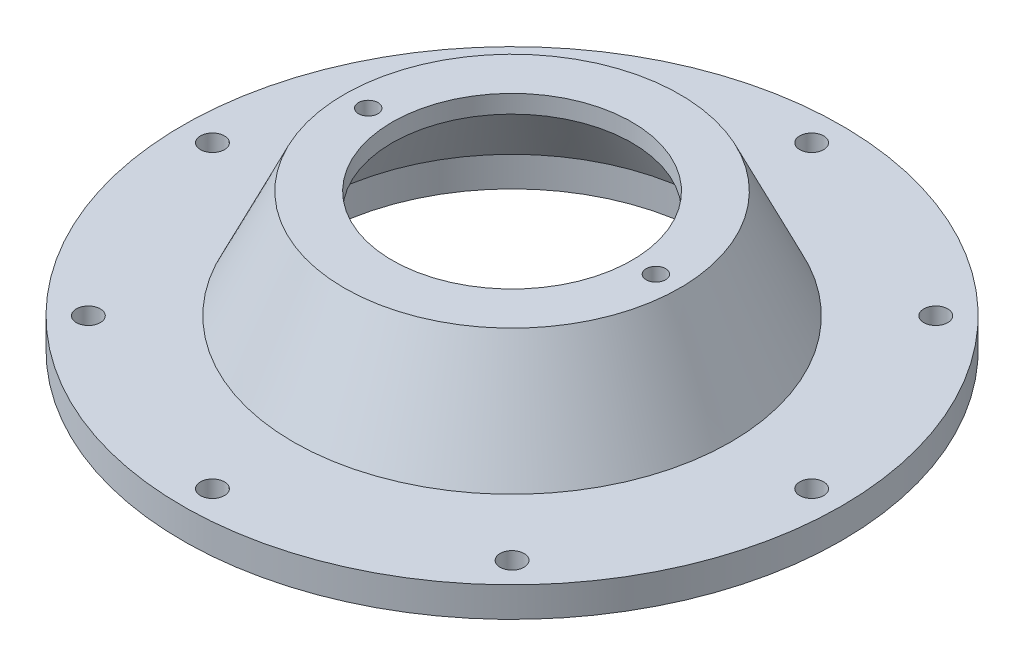
ISO-10303-21;
HEADER;
FILE_DESCRIPTION(('STEP AP214'),'2;1');
FILE_NAME('part.step','',(''),(''),'','','');
FILE_SCHEMA(('AUTOMOTIVE_DESIGN { 1 0 10303 214 1 1 1 1 }'));
ENDSEC;
DATA;
#1=APPLICATION_CONTEXT('core data for automotive mechanical design processes');
#2=APPLICATION_PROTOCOL_DEFINITION('international standard','automotive_design',2000,#1);
#3=PRODUCT_CONTEXT('',#1,'mechanical');
#4=PRODUCT('Part','Part','',(#3));
#5=PRODUCT_RELATED_PRODUCT_CATEGORY('part','',(#4));
#6=PRODUCT_DEFINITION_FORMATION('','',#4);
#7=PRODUCT_DEFINITION_CONTEXT('part definition',#1,'design');
#8=PRODUCT_DEFINITION('design','',#6,#7);
#9=PRODUCT_DEFINITION_SHAPE('','',#8);
#10=(LENGTH_UNIT() NAMED_UNIT(*) SI_UNIT(.MILLI.,.METRE.));
#11=(NAMED_UNIT(*) PLANE_ANGLE_UNIT() SI_UNIT($,.RADIAN.));
#12=(NAMED_UNIT(*) SI_UNIT($,.STERADIAN.) SOLID_ANGLE_UNIT());
#13=UNCERTAINTY_MEASURE_WITH_UNIT(LENGTH_MEASURE(1.E-05),#10,'distance_accuracy_value','');
#14=(GEOMETRIC_REPRESENTATION_CONTEXT(3) GLOBAL_UNCERTAINTY_ASSIGNED_CONTEXT((#13)) GLOBAL_UNIT_ASSIGNED_CONTEXT((#10,
#11,#12)) REPRESENTATION_CONTEXT('',''));
#15=CARTESIAN_POINT('',(0.,0.,0.));
#16=DIRECTION('',(0.,0.,1.));
#17=DIRECTION('',(1.,0.,0.));
#18=AXIS2_PLACEMENT_3D('',#15,#16,#17);
#19=CARTESIAN_POINT('',(0.,0.,0.));
#20=DIRECTION('',(0.,1.,0.));
#21=DIRECTION('',(1.,0.,0.));
#22=AXIS2_PLACEMENT_3D('',#19,#20,#21);
#23=PLANE('',#22);
#24=CARTESIAN_POINT('',(0.,0.,0.));
#25=DIRECTION('',(0.,-1.,0.));
#26=DIRECTION('',(1.,0.,0.));
#27=AXIS2_PLACEMENT_3D('',#24,#25,#26);
#28=CIRCLE('',#27,33.);
#29=CARTESIAN_POINT('',(-33.,0.,0.));
#30=VERTEX_POINT('',#29);
#31=EDGE_CURVE('E280',#30,#30,#28,.T.);
#32=ORIENTED_EDGE('',*,*,#31,.F.);
#33=EDGE_LOOP('',(#32));
#34=FACE_BOUND('',#33,.T.);
#35=CARTESIAN_POINT('',(-35.3553390593274,0.,-35.3553390593274));
#36=DIRECTION('',(0.,1.,0.));
#37=DIRECTION('',(1.,0.,0.));
#38=AXIS2_PLACEMENT_3D('',#35,#36,#37);
#39=CIRCLE('',#38,2.);
#40=CARTESIAN_POINT('',(-37.3553390593274,0.,-35.3553390593274));
#41=VERTEX_POINT('',#40);
#42=EDGE_CURVE('E281',#41,#41,#39,.T.);
#43=ORIENTED_EDGE('',*,*,#42,.T.);
#44=EDGE_LOOP('',(#43));
#45=FACE_BOUND('',#44,.T.);
#46=CARTESIAN_POINT('',(35.3553390593274,0.,-35.3553390593274));
#47=DIRECTION('',(0.,1.,0.));
#48=DIRECTION('',(1.,0.,0.));
#49=AXIS2_PLACEMENT_3D('',#46,#47,#48);
#50=CIRCLE('',#49,2.);
#51=CARTESIAN_POINT('',(33.3553390593274,0.,-35.3553390593274));
#52=VERTEX_POINT('',#51);
#53=EDGE_CURVE('E181',#52,#52,#50,.T.);
#54=ORIENTED_EDGE('',*,*,#53,.T.);
#55=EDGE_LOOP('',(#54));
#56=FACE_BOUND('',#55,.T.);
#57=CARTESIAN_POINT('',(35.3553390593274,0.,35.3553390593274));
#58=DIRECTION('',(0.,1.,0.));
#59=DIRECTION('',(1.,0.,0.));
#60=AXIS2_PLACEMENT_3D('',#57,#58,#59);
#61=CIRCLE('',#60,2.);
#62=CARTESIAN_POINT('',(33.3553390593274,0.,35.3553390593274));
#63=VERTEX_POINT('',#62);
#64=EDGE_CURVE('E244',#63,#63,#61,.T.);
#65=ORIENTED_EDGE('',*,*,#64,.T.);
#66=EDGE_LOOP('',(#65));
#67=FACE_BOUND('',#66,.T.);
#68=CARTESIAN_POINT('',(-35.3553390593274,0.,35.3553390593274));
#69=DIRECTION('',(0.,1.,0.));
#70=DIRECTION('',(1.,0.,0.));
#71=AXIS2_PLACEMENT_3D('',#68,#69,#70);
#72=CIRCLE('',#71,2.);
#73=CARTESIAN_POINT('',(-37.3553390593274,0.,35.3553390593274));
#74=VERTEX_POINT('',#73);
#75=EDGE_CURVE('E231',#74,#74,#72,.T.);
#76=ORIENTED_EDGE('',*,*,#75,.T.);
#77=EDGE_LOOP('',(#76));
#78=FACE_BOUND('',#77,.T.);
#79=CARTESIAN_POINT('',(-50.,0.,0.));
#80=DIRECTION('',(0.,1.,0.));
#81=DIRECTION('',(1.,0.,0.));
#82=AXIS2_PLACEMENT_3D('',#79,#80,#81);
#83=CIRCLE('',#82,2.);
#84=CARTESIAN_POINT('',(-52.,0.,0.));
#85=VERTEX_POINT('',#84);
#86=EDGE_CURVE('E222',#85,#85,#83,.T.);
#87=ORIENTED_EDGE('',*,*,#86,.T.);
#88=EDGE_LOOP('',(#87));
#89=FACE_BOUND('',#88,.T.);
#90=CARTESIAN_POINT('',(0.,0.,50.));
#91=DIRECTION('',(0.,1.,0.));
#92=DIRECTION('',(1.,0.,0.));
#93=AXIS2_PLACEMENT_3D('',#90,#91,#92);
#94=CIRCLE('',#93,2.);
#95=CARTESIAN_POINT('',(-2.,0.,50.));
#96=VERTEX_POINT('',#95);
#97=EDGE_CURVE('E185',#96,#96,#94,.T.);
#98=ORIENTED_EDGE('',*,*,#97,.T.);
#99=EDGE_LOOP('',(#98));
#100=FACE_BOUND('',#99,.T.);
#101=CARTESIAN_POINT('',(50.,0.,0.));
#102=DIRECTION('',(0.,1.,0.));
#103=DIRECTION('',(1.,0.,0.));
#104=AXIS2_PLACEMENT_3D('',#101,#102,#103);
#105=CIRCLE('',#104,2.);
#106=CARTESIAN_POINT('',(48.,0.,0.));
#107=VERTEX_POINT('',#106);
#108=EDGE_CURVE('E199',#107,#107,#105,.T.);
#109=ORIENTED_EDGE('',*,*,#108,.T.);
#110=EDGE_LOOP('',(#109));
#111=FACE_BOUND('',#110,.T.);
#112=CARTESIAN_POINT('',(0.,0.,-50.));
#113=DIRECTION('',(0.,1.,0.));
#114=DIRECTION('',(1.,0.,0.));
#115=AXIS2_PLACEMENT_3D('',#112,#113,#114);
#116=CIRCLE('',#115,2.);
#117=CARTESIAN_POINT('',(-2.,0.,-50.));
#118=VERTEX_POINT('',#117);
#119=EDGE_CURVE('E210',#118,#118,#116,.T.);
#120=ORIENTED_EDGE('',*,*,#119,.T.);
#121=EDGE_LOOP('',(#120));
#122=FACE_BOUND('',#121,.T.);
#123=CARTESIAN_POINT('',(0.,0.,0.));
#124=DIRECTION('',(0.,1.,0.));
#125=DIRECTION('',(-1.,0.,0.));
#126=AXIS2_PLACEMENT_3D('',#123,#124,#125);
#127=CIRCLE('',#126,55.);
#128=CARTESIAN_POINT('',(55.,0.,0.));
#129=VERTEX_POINT('',#128);
#130=EDGE_CURVE('E10',#129,#129,#127,.T.);
#131=ORIENTED_EDGE('',*,*,#130,.F.);
#132=EDGE_LOOP('',(#131));
#133=FACE_BOUND('',#132,.T.);
#134=ADVANCED_FACE('F16',(#34,#45,#56,#67,#78,#89,#100,#111,#122,#133),#23,.F.);
#135=CARTESIAN_POINT('',(0.,5.,0.));
#136=DIRECTION('',(0.,1.,0.));
#137=DIRECTION('',(1.,0.,0.));
#138=AXIS2_PLACEMENT_3D('',#135,#136,#137);
#139=PLANE('',#138);
#140=CARTESIAN_POINT('',(0.,5.,0.));
#141=DIRECTION('',(0.,-1.,0.));
#142=DIRECTION('',(0.,0.,-1.));
#143=AXIS2_PLACEMENT_3D('',#140,#141,#142);
#144=CIRCLE('',#143,36.5);
#145=CARTESIAN_POINT('',(0.,5.,36.5));
#146=VERTEX_POINT('',#145);
#147=EDGE_CURVE('E272',#146,#146,#144,.T.);
#148=ORIENTED_EDGE('',*,*,#147,.T.);
#149=EDGE_LOOP('',(#148));
#150=FACE_BOUND('',#149,.T.);
#151=CARTESIAN_POINT('',(-35.3553390593274,5.,-35.3553390593274));
#152=DIRECTION('',(0.,-1.,0.));
#153=DIRECTION('',(1.,0.,0.));
#154=AXIS2_PLACEMENT_3D('',#151,#152,#153);
#155=CIRCLE('',#154,2.);
#156=CARTESIAN_POINT('',(-37.3553390593274,5.,-35.3553390593274));
#157=VERTEX_POINT('',#156);
#158=EDGE_CURVE('E183',#157,#157,#155,.T.);
#159=ORIENTED_EDGE('',*,*,#158,.T.);
#160=EDGE_LOOP('',(#159));
#161=FACE_BOUND('',#160,.T.);
#162=CARTESIAN_POINT('',(35.3553390593274,5.,-35.3553390593274));
#163=DIRECTION('',(0.,-1.,0.));
#164=DIRECTION('',(1.,0.,0.));
#165=AXIS2_PLACEMENT_3D('',#162,#163,#164);
#166=CIRCLE('',#165,2.);
#167=CARTESIAN_POINT('',(33.3553390593274,5.,-35.3553390593274));
#168=VERTEX_POINT('',#167);
#169=EDGE_CURVE('E204',#168,#168,#166,.T.);
#170=ORIENTED_EDGE('',*,*,#169,.T.);
#171=EDGE_LOOP('',(#170));
#172=FACE_BOUND('',#171,.T.);
#173=CARTESIAN_POINT('',(35.3553390593274,5.,35.3553390593274));
#174=DIRECTION('',(0.,-1.,0.));
#175=DIRECTION('',(1.,0.,0.));
#176=AXIS2_PLACEMENT_3D('',#173,#174,#175);
#177=CIRCLE('',#176,2.);
#178=CARTESIAN_POINT('',(33.3553390593274,5.,35.3553390593274));
#179=VERTEX_POINT('',#178);
#180=EDGE_CURVE('E226',#179,#179,#177,.T.);
#181=ORIENTED_EDGE('',*,*,#180,.T.);
#182=EDGE_LOOP('',(#181));
#183=FACE_BOUND('',#182,.T.);
#184=CARTESIAN_POINT('',(-35.3553390593274,5.,35.3553390593274));
#185=DIRECTION('',(0.,-1.,0.));
#186=DIRECTION('',(1.,0.,0.));
#187=AXIS2_PLACEMENT_3D('',#184,#185,#186);
#188=CIRCLE('',#187,2.);
#189=CARTESIAN_POINT('',(-37.3553390593274,5.,35.3553390593274));
#190=VERTEX_POINT('',#189);
#191=EDGE_CURVE('E218',#190,#190,#188,.T.);
#192=ORIENTED_EDGE('',*,*,#191,.T.);
#193=EDGE_LOOP('',(#192));
#194=FACE_BOUND('',#193,.T.);
#195=CARTESIAN_POINT('',(-50.,5.,0.));
#196=DIRECTION('',(0.,-1.,0.));
#197=DIRECTION('',(1.,0.,0.));
#198=AXIS2_PLACEMENT_3D('',#195,#196,#197);
#199=CIRCLE('',#198,2.);
#200=CARTESIAN_POINT('',(-52.,5.,0.));
#201=VERTEX_POINT('',#200);
#202=EDGE_CURVE('E189',#201,#201,#199,.T.);
#203=ORIENTED_EDGE('',*,*,#202,.T.);
#204=EDGE_LOOP('',(#203));
#205=FACE_BOUND('',#204,.T.);
#206=CARTESIAN_POINT('',(0.,5.,50.));
#207=DIRECTION('',(0.,-1.,0.));
#208=DIRECTION('',(1.,0.,0.));
#209=AXIS2_PLACEMENT_3D('',#206,#207,#208);
#210=CIRCLE('',#209,2.);
#211=CARTESIAN_POINT('',(-2.,5.,50.));
#212=VERTEX_POINT('',#211);
#213=EDGE_CURVE('E251',#212,#212,#210,.T.);
#214=ORIENTED_EDGE('',*,*,#213,.T.);
#215=EDGE_LOOP('',(#214));
#216=FACE_BOUND('',#215,.T.);
#217=CARTESIAN_POINT('',(50.,5.,0.));
#218=DIRECTION('',(0.,-1.,0.));
#219=DIRECTION('',(1.,0.,0.));
#220=AXIS2_PLACEMENT_3D('',#217,#218,#219);
#221=CIRCLE('',#220,2.);
#222=CARTESIAN_POINT('',(48.,5.,0.));
#223=VERTEX_POINT('',#222);
#224=EDGE_CURVE('E200',#223,#223,#221,.T.);
#225=ORIENTED_EDGE('',*,*,#224,.T.);
#226=EDGE_LOOP('',(#225));
#227=FACE_BOUND('',#226,.T.);
#228=CARTESIAN_POINT('',(0.,5.,-50.));
#229=DIRECTION('',(0.,-1.,0.));
#230=DIRECTION('',(1.,0.,0.));
#231=AXIS2_PLACEMENT_3D('',#228,#229,#230);
#232=CIRCLE('',#231,2.);
#233=CARTESIAN_POINT('',(-2.,5.,-50.));
#234=VERTEX_POINT('',#233);
#235=EDGE_CURVE('E193',#234,#234,#232,.T.);
#236=ORIENTED_EDGE('',*,*,#235,.T.);
#237=EDGE_LOOP('',(#236));
#238=FACE_BOUND('',#237,.T.);
#239=CARTESIAN_POINT('',(0.,5.,0.));
#240=DIRECTION('',(0.,1.,0.));
#241=DIRECTION('',(-1.,0.,0.));
#242=AXIS2_PLACEMENT_3D('',#239,#240,#241);
#243=CIRCLE('',#242,55.);
#244=CARTESIAN_POINT('',(55.,5.,0.));
#245=VERTEX_POINT('',#244);
#246=EDGE_CURVE('E238',#245,#245,#243,.T.);
#247=ORIENTED_EDGE('',*,*,#246,.T.);
#248=EDGE_LOOP('',(#247));
#249=FACE_BOUND('',#248,.T.);
#250=ADVANCED_FACE('F291',(#150,#161,#172,#183,#194,#205,#216,#227,#238,#249),#139,.T.);
#251=CARTESIAN_POINT('',(0.,0.,0.));
#252=DIRECTION('',(0.,1.,0.));
#253=DIRECTION('',(-1.,0.,0.));
#254=AXIS2_PLACEMENT_3D('',#251,#252,#253);
#255=CYLINDRICAL_SURFACE('',#254,55.);
#256=ORIENTED_EDGE('',*,*,#246,.F.);
#257=DIRECTION('',(0.,-1.,0.));
#258=VECTOR('',#257,1.);
#259=CARTESIAN_POINT('',(55.,0.,0.));
#260=LINE('',#259,#258);
#261=EDGE_CURVE('E27',#245,#129,#260,.T.);
#262=ORIENTED_EDGE('',*,*,#261,.T.);
#263=ORIENTED_EDGE('',*,*,#130,.T.);
#264=ORIENTED_EDGE('',*,*,#261,.F.);
#265=EDGE_LOOP('',(#256,#262,#263,#264));
#266=FACE_BOUND('',#265,.T.);
#267=ADVANCED_FACE('F294',(#266),#255,.T.);
#268=CARTESIAN_POINT('',(0.,0.,0.));
#269=DIRECTION('',(0.,1.,0.));
#270=DIRECTION('',(1.,0.,0.));
#271=AXIS2_PLACEMENT_3D('',#268,#269,#270);
#272=CYLINDRICAL_SURFACE('',#271,33.);
#273=CARTESIAN_POINT('',(0.,5.,0.));
#274=DIRECTION('',(0.,-1.,0.));
#275=DIRECTION('',(1.,0.,0.));
#276=AXIS2_PLACEMENT_3D('',#273,#274,#275);
#277=CIRCLE('',#276,33.);
#278=CARTESIAN_POINT('',(-33.,5.,0.));
#279=VERTEX_POINT('',#278);
#280=CARTESIAN_POINT('',(0.,5.,33.));
#281=VERTEX_POINT('',#280);
#282=EDGE_CURVE('E205',#279,#281,#277,.T.);
#283=ORIENTED_EDGE('',*,*,#282,.F.);
#284=DIRECTION('',(0.,-1.,0.));
#285=VECTOR('',#284,1.);
#286=CARTESIAN_POINT('',(-33.,0.,0.));
#287=LINE('',#286,#285);
#288=EDGE_CURVE('E359',#279,#30,#287,.T.);
#289=ORIENTED_EDGE('',*,*,#288,.T.);
#290=ORIENTED_EDGE('',*,*,#31,.T.);
#291=ORIENTED_EDGE('',*,*,#288,.F.);
#292=CARTESIAN_POINT('',(0.,5.,0.));
#293=DIRECTION('',(0.,-1.,0.));
#294=DIRECTION('',(1.,0.,0.));
#295=AXIS2_PLACEMENT_3D('',#292,#293,#294);
#296=CIRCLE('',#295,33.);
#297=EDGE_CURVE('E343',#281,#279,#296,.T.);
#298=ORIENTED_EDGE('',*,*,#297,.F.);
#299=EDGE_LOOP('',(#283,#289,#290,#291,#298));
#300=FACE_BOUND('',#299,.T.);
#301=ADVANCED_FACE('F299',(#300),#272,.F.);
#302=CARTESIAN_POINT('',(0.,23.,-28.));
#303=DIRECTION('',(0.,1.,0.));
#304=DIRECTION('',(1.,0.,0.));
#305=AXIS2_PLACEMENT_3D('',#302,#303,#304);
#306=PLANE('',#305);
#307=CARTESIAN_POINT('',(-24.,23.,0.));
#308=DIRECTION('',(0.,-1.,0.));
#309=DIRECTION('',(1.,0.,0.));
#310=AXIS2_PLACEMENT_3D('',#307,#308,#309);
#311=CIRCLE('',#310,1.621);
#312=CARTESIAN_POINT('',(-25.621,23.,0.));
#313=VERTEX_POINT('',#312);
#314=EDGE_CURVE('E239',#313,#313,#311,.T.);
#315=ORIENTED_EDGE('',*,*,#314,.T.);
#316=EDGE_LOOP('',(#315));
#317=FACE_BOUND('',#316,.T.);
#318=CARTESIAN_POINT('',(24.,23.,0.));
#319=DIRECTION('',(0.,-1.,0.));
#320=DIRECTION('',(1.,0.,0.));
#321=AXIS2_PLACEMENT_3D('',#318,#319,#320);
#322=CIRCLE('',#321,1.621);
#323=CARTESIAN_POINT('',(22.379,23.,0.));
#324=VERTEX_POINT('',#323);
#325=EDGE_CURVE('E164',#324,#324,#322,.T.);
#326=ORIENTED_EDGE('',*,*,#325,.T.);
#327=EDGE_LOOP('',(#326));
#328=FACE_BOUND('',#327,.T.);
#329=CARTESIAN_POINT('',(0.,23.,0.));
#330=DIRECTION('',(0.,-1.,0.));
#331=DIRECTION('',(1.,0.,0.));
#332=AXIS2_PLACEMENT_3D('',#329,#330,#331);
#333=CIRCLE('',#332,20.);
#334=CARTESIAN_POINT('',(-20.,23.,0.));
#335=VERTEX_POINT('',#334);
#336=EDGE_CURVE('E175',#335,#335,#333,.T.);
#337=ORIENTED_EDGE('',*,*,#336,.T.);
#338=EDGE_LOOP('',(#337));
#339=FACE_BOUND('',#338,.T.);
#340=CARTESIAN_POINT('',(0.,23.,0.));
#341=DIRECTION('',(0.,-1.,0.));
#342=DIRECTION('',(1.,0.,0.));
#343=AXIS2_PLACEMENT_3D('',#340,#341,#342);
#344=CIRCLE('',#343,28.);
#345=CARTESIAN_POINT('',(0.,23.,28.));
#346=VERTEX_POINT('',#345);
#347=EDGE_CURVE('E209',#346,#346,#344,.T.);
#348=ORIENTED_EDGE('',*,*,#347,.F.);
#349=EDGE_LOOP('',(#348));
#350=FACE_BOUND('',#349,.T.);
#351=ADVANCED_FACE('F305',(#317,#328,#339,#350),#306,.T.);
#352=CARTESIAN_POINT('',(0.,20.,0.));
#353=DIRECTION('',(0.,-1.,0.));
#354=DIRECTION('',(0.,0.,-1.));
#355=AXIS2_PLACEMENT_3D('',#352,#353,#354);
#356=PLANE('',#355);
#357=CARTESIAN_POINT('',(-24.,20.,0.));
#358=DIRECTION('',(0.,1.,0.));
#359=DIRECTION('',(1.,0.,0.));
#360=AXIS2_PLACEMENT_3D('',#357,#358,#359);
#361=CIRCLE('',#360,1.621);
#362=CARTESIAN_POINT('',(-25.621,20.,0.));
#363=VERTEX_POINT('',#362);
#364=EDGE_CURVE('E105',#363,#363,#361,.T.);
#365=ORIENTED_EDGE('',*,*,#364,.T.);
#366=EDGE_LOOP('',(#365));
#367=FACE_BOUND('',#366,.T.);
#368=CARTESIAN_POINT('',(24.,20.,0.));
#369=DIRECTION('',(0.,1.,0.));
#370=DIRECTION('',(1.,0.,0.));
#371=AXIS2_PLACEMENT_3D('',#368,#369,#370);
#372=CIRCLE('',#371,1.621);
#373=CARTESIAN_POINT('',(22.379,20.,0.));
#374=VERTEX_POINT('',#373);
#375=EDGE_CURVE('E243',#374,#374,#372,.T.);
#376=ORIENTED_EDGE('',*,*,#375,.T.);
#377=EDGE_LOOP('',(#376));
#378=FACE_BOUND('',#377,.T.);
#379=CARTESIAN_POINT('',(0.,20.,0.));
#380=DIRECTION('',(0.,1.,0.));
#381=DIRECTION('',(1.,0.,0.));
#382=AXIS2_PLACEMENT_3D('',#379,#380,#381);
#383=CIRCLE('',#382,20.);
#384=CARTESIAN_POINT('',(-20.,20.,0.));
#385=VERTEX_POINT('',#384);
#386=EDGE_CURVE('E158',#385,#385,#383,.T.);
#387=ORIENTED_EDGE('',*,*,#386,.T.);
#388=EDGE_LOOP('',(#387));
#389=FACE_BOUND('',#388,.T.);
#390=CARTESIAN_POINT('',(0.,20.,0.));
#391=DIRECTION('',(0.,-1.,0.));
#392=DIRECTION('',(1.,0.,0.));
#393=AXIS2_PLACEMENT_3D('',#390,#391,#392);
#394=CIRCLE('',#393,25.9166666666667);
#395=CARTESIAN_POINT('',(0.,20.,25.9166666666667));
#396=VERTEX_POINT('',#395);
#397=EDGE_CURVE('E372',#396,#396,#394,.T.);
#398=ORIENTED_EDGE('',*,*,#397,.T.);
#399=EDGE_LOOP('',(#398));
#400=FACE_BOUND('',#399,.T.);
#401=ADVANCED_FACE('F159',(#367,#378,#389,#400),#356,.T.);
#402=CARTESIAN_POINT('',(0.,12.5,0.));
#403=DIRECTION('',(0.,-1.,0.));
#404=DIRECTION('',(0.,0.,-1.));
#405=AXIS2_PLACEMENT_3D('',#402,#403,#404);
#406=CONICAL_SURFACE('',#405,29.4583333333333,0.441179480414981);
#407=ORIENTED_EDGE('',*,*,#282,.T.);
#408=DIRECTION('',(0.,0.904248646745991,-0.427006305407829));
#409=VECTOR('',#408,1.);
#410=CARTESIAN_POINT('',(0.,12.5,29.4583333333333));
#411=LINE('',#410,#409);
#412=EDGE_CURVE('E179',#281,#396,#411,.T.);
#413=ORIENTED_EDGE('',*,*,#412,.T.);
#414=ORIENTED_EDGE('',*,*,#397,.F.);
#415=ORIENTED_EDGE('',*,*,#412,.F.);
#416=ORIENTED_EDGE('',*,*,#297,.T.);
#417=EDGE_LOOP('',(#407,#413,#414,#415,#416));
#418=FACE_BOUND('',#417,.T.);
#419=ADVANCED_FACE('F319',(#418),#406,.F.);
#420=CARTESIAN_POINT('',(0.,14.,0.));
#421=DIRECTION('',(0.,-1.,0.));
#422=DIRECTION('',(0.,0.,-1.));
#423=AXIS2_PLACEMENT_3D('',#420,#421,#422);
#424=CONICAL_SURFACE('',#423,32.25,0.441179480414981);
#425=ORIENTED_EDGE('',*,*,#147,.F.);
#426=DIRECTION('',(0.,0.904248646745991,-0.427006305407829));
#427=VECTOR('',#426,1.);
#428=CARTESIAN_POINT('',(0.,14.,32.25));
#429=LINE('',#428,#427);
#430=EDGE_CURVE('E225',#146,#346,#429,.T.);
#431=ORIENTED_EDGE('',*,*,#430,.T.);
#432=ORIENTED_EDGE('',*,*,#347,.T.);
#433=ORIENTED_EDGE('',*,*,#430,.F.);
#434=EDGE_LOOP('',(#425,#431,#432,#433));
#435=FACE_BOUND('',#434,.T.);
#436=ADVANCED_FACE('F330',(#435),#424,.T.);
#437=CARTESIAN_POINT('',(-35.3553390593274,-152.254570680791,-35.3553390593274));
#438=DIRECTION('',(0.,1.,0.));
#439=DIRECTION('',(1.,0.,0.));
#440=AXIS2_PLACEMENT_3D('',#437,#438,#439);
#441=CYLINDRICAL_SURFACE('',#440,2.);
#442=ORIENTED_EDGE('',*,*,#158,.F.);
#443=DIRECTION('',(0.,-1.,0.));
#444=VECTOR('',#443,1.);
#445=CARTESIAN_POINT('',(-37.3553390593274,-152.254570680791,-35.3553390593274));
#446=LINE('',#445,#444);
#447=EDGE_CURVE('E235',#157,#41,#446,.T.);
#448=ORIENTED_EDGE('',*,*,#447,.T.);
#449=ORIENTED_EDGE('',*,*,#42,.F.);
#450=ORIENTED_EDGE('',*,*,#447,.F.);
#451=EDGE_LOOP('',(#442,#448,#449,#450));
#452=FACE_BOUND('',#451,.T.);
#453=ADVANCED_FACE('F462',(#452),#441,.F.);
#454=CARTESIAN_POINT('',(35.3553390593274,-152.254570680791,-35.3553390593274));
#455=DIRECTION('',(0.,1.,0.));
#456=DIRECTION('',(1.,0.,0.));
#457=AXIS2_PLACEMENT_3D('',#454,#455,#456);
#458=CYLINDRICAL_SURFACE('',#457,2.);
#459=ORIENTED_EDGE('',*,*,#169,.F.);
#460=DIRECTION('',(0.,-1.,0.));
#461=VECTOR('',#460,1.);
#462=CARTESIAN_POINT('',(33.3553390593274,-152.254570680791,-35.3553390593274));
#463=LINE('',#462,#461);
#464=EDGE_CURVE('E184',#168,#52,#463,.T.);
#465=ORIENTED_EDGE('',*,*,#464,.T.);
#466=ORIENTED_EDGE('',*,*,#53,.F.);
#467=ORIENTED_EDGE('',*,*,#464,.F.);
#468=EDGE_LOOP('',(#459,#465,#466,#467));
#469=FACE_BOUND('',#468,.T.);
#470=ADVANCED_FACE('F453',(#469),#458,.F.);
#471=CARTESIAN_POINT('',(35.3553390593274,-152.254570680791,35.3553390593274));
#472=DIRECTION('',(0.,1.,0.));
#473=DIRECTION('',(1.,0.,0.));
#474=AXIS2_PLACEMENT_3D('',#471,#472,#473);
#475=CYLINDRICAL_SURFACE('',#474,2.);
#476=ORIENTED_EDGE('',*,*,#180,.F.);
#477=DIRECTION('',(0.,-1.,0.));
#478=VECTOR('',#477,1.);
#479=CARTESIAN_POINT('',(33.3553390593274,-152.254570680791,35.3553390593274));
#480=LINE('',#479,#478);
#481=EDGE_CURVE('E230',#179,#63,#480,.T.);
#482=ORIENTED_EDGE('',*,*,#481,.T.);
#483=ORIENTED_EDGE('',*,*,#64,.F.);
#484=ORIENTED_EDGE('',*,*,#481,.F.);
#485=EDGE_LOOP('',(#476,#482,#483,#484));
#486=FACE_BOUND('',#485,.T.);
#487=ADVANCED_FACE('F450',(#486),#475,.F.);
#488=CARTESIAN_POINT('',(-35.3553390593274,-152.254570680791,35.3553390593274));
#489=DIRECTION('',(0.,1.,0.));
#490=DIRECTION('',(1.,0.,0.));
#491=AXIS2_PLACEMENT_3D('',#488,#489,#490);
#492=CYLINDRICAL_SURFACE('',#491,2.);
#493=ORIENTED_EDGE('',*,*,#191,.F.);
#494=DIRECTION('',(0.,-1.,0.));
#495=VECTOR('',#494,1.);
#496=CARTESIAN_POINT('',(-37.3553390593274,-152.254570680791,35.3553390593274));
#497=LINE('',#496,#495);
#498=EDGE_CURVE('E20',#190,#74,#497,.T.);
#499=ORIENTED_EDGE('',*,*,#498,.T.);
#500=ORIENTED_EDGE('',*,*,#75,.F.);
#501=ORIENTED_EDGE('',*,*,#498,.F.);
#502=EDGE_LOOP('',(#493,#499,#500,#501));
#503=FACE_BOUND('',#502,.T.);
#504=ADVANCED_FACE('F323',(#503),#492,.F.);
#505=CARTESIAN_POINT('',(-50.,-152.254570680791,0.));
#506=DIRECTION('',(0.,1.,0.));
#507=DIRECTION('',(1.,0.,0.));
#508=AXIS2_PLACEMENT_3D('',#505,#506,#507);
#509=CYLINDRICAL_SURFACE('',#508,2.);
#510=ORIENTED_EDGE('',*,*,#202,.F.);
#511=DIRECTION('',(0.,-1.,0.));
#512=VECTOR('',#511,1.);
#513=CARTESIAN_POINT('',(-52.,-152.254570680791,0.));
#514=LINE('',#513,#512);
#515=EDGE_CURVE('E276',#201,#85,#514,.T.);
#516=ORIENTED_EDGE('',*,*,#515,.T.);
#517=ORIENTED_EDGE('',*,*,#86,.F.);
#518=ORIENTED_EDGE('',*,*,#515,.F.);
#519=EDGE_LOOP('',(#510,#516,#517,#518));
#520=FACE_BOUND('',#519,.T.);
#521=ADVANCED_FACE('F321',(#520),#509,.F.);
#522=CARTESIAN_POINT('',(0.,-152.254570680791,50.));
#523=DIRECTION('',(0.,1.,0.));
#524=DIRECTION('',(1.,0.,0.));
#525=AXIS2_PLACEMENT_3D('',#522,#523,#524);
#526=CYLINDRICAL_SURFACE('',#525,2.);
#527=ORIENTED_EDGE('',*,*,#213,.F.);
#528=DIRECTION('',(0.,-1.,0.));
#529=VECTOR('',#528,1.);
#530=CARTESIAN_POINT('',(-2.,-152.254570680791,50.));
#531=LINE('',#530,#529);
#532=EDGE_CURVE('E190',#212,#96,#531,.T.);
#533=ORIENTED_EDGE('',*,*,#532,.T.);
#534=ORIENTED_EDGE('',*,*,#97,.F.);
#535=ORIENTED_EDGE('',*,*,#532,.F.);
#536=EDGE_LOOP('',(#527,#533,#534,#535));
#537=FACE_BOUND('',#536,.T.);
#538=ADVANCED_FACE('F18',(#537),#526,.F.);
#539=CARTESIAN_POINT('',(50.,-152.254570680791,0.));
#540=DIRECTION('',(0.,1.,0.));
#541=DIRECTION('',(1.,0.,0.));
#542=AXIS2_PLACEMENT_3D('',#539,#540,#541);
#543=CYLINDRICAL_SURFACE('',#542,2.);
#544=ORIENTED_EDGE('',*,*,#224,.F.);
#545=DIRECTION('',(0.,-1.,0.));
#546=VECTOR('',#545,1.);
#547=CARTESIAN_POINT('',(48.,-152.254570680791,0.));
#548=LINE('',#547,#546);
#549=EDGE_CURVE('E195',#223,#107,#548,.T.);
#550=ORIENTED_EDGE('',*,*,#549,.T.);
#551=ORIENTED_EDGE('',*,*,#108,.F.);
#552=ORIENTED_EDGE('',*,*,#549,.F.);
#553=EDGE_LOOP('',(#544,#550,#551,#552));
#554=FACE_BOUND('',#553,.T.);
#555=ADVANCED_FACE('F403',(#554),#543,.F.);
#556=CARTESIAN_POINT('',(0.,-152.254570680791,-50.));
#557=DIRECTION('',(0.,1.,0.));
#558=DIRECTION('',(1.,0.,0.));
#559=AXIS2_PLACEMENT_3D('',#556,#557,#558);
#560=CYLINDRICAL_SURFACE('',#559,2.);
#561=ORIENTED_EDGE('',*,*,#235,.F.);
#562=DIRECTION('',(0.,-1.,0.));
#563=VECTOR('',#562,1.);
#564=CARTESIAN_POINT('',(-2.,-152.254570680791,-50.));
#565=LINE('',#564,#563);
#566=EDGE_CURVE('E116',#234,#118,#565,.T.);
#567=ORIENTED_EDGE('',*,*,#566,.T.);
#568=ORIENTED_EDGE('',*,*,#119,.F.);
#569=ORIENTED_EDGE('',*,*,#566,.F.);
#570=EDGE_LOOP('',(#561,#567,#568,#569));
#571=FACE_BOUND('',#570,.T.);
#572=ADVANCED_FACE('F289',(#571),#560,.F.);
#573=CARTESIAN_POINT('',(-24.,-134.254570680791,0.));
#574=DIRECTION('',(0.,1.,0.));
#575=DIRECTION('',(1.,0.,0.));
#576=AXIS2_PLACEMENT_3D('',#573,#574,#575);
#577=CYLINDRICAL_SURFACE('',#576,1.621);
#578=ORIENTED_EDGE('',*,*,#314,.F.);
#579=DIRECTION('',(0.,-1.,0.));
#580=VECTOR('',#579,1.);
#581=CARTESIAN_POINT('',(-25.621,-134.254570680791,0.));
#582=LINE('',#581,#580);
#583=EDGE_CURVE('E194',#313,#363,#582,.T.);
#584=ORIENTED_EDGE('',*,*,#583,.T.);
#585=ORIENTED_EDGE('',*,*,#364,.F.);
#586=ORIENTED_EDGE('',*,*,#583,.F.);
#587=EDGE_LOOP('',(#578,#584,#585,#586));
#588=FACE_BOUND('',#587,.T.);
#589=ADVANCED_FACE('F447',(#588),#577,.F.);
#590=CARTESIAN_POINT('',(24.,-134.254570680791,0.));
#591=DIRECTION('',(0.,1.,0.));
#592=DIRECTION('',(1.,0.,0.));
#593=AXIS2_PLACEMENT_3D('',#590,#591,#592);
#594=CYLINDRICAL_SURFACE('',#593,1.621);
#595=ORIENTED_EDGE('',*,*,#325,.F.);
#596=DIRECTION('',(0.,-1.,0.));
#597=VECTOR('',#596,1.);
#598=CARTESIAN_POINT('',(22.379,-134.254570680791,0.));
#599=LINE('',#598,#597);
#600=EDGE_CURVE('E172',#324,#374,#599,.T.);
#601=ORIENTED_EDGE('',*,*,#600,.T.);
#602=ORIENTED_EDGE('',*,*,#375,.F.);
#603=ORIENTED_EDGE('',*,*,#600,.F.);
#604=EDGE_LOOP('',(#595,#601,#602,#603));
#605=FACE_BOUND('',#604,.T.);
#606=ADVANCED_FACE('F457',(#605),#594,.F.);
#607=CARTESIAN_POINT('',(0.,23.,0.));
#608=DIRECTION('',(0.,-1.,0.));
#609=DIRECTION('',(1.,0.,0.));
#610=AXIS2_PLACEMENT_3D('',#607,#608,#609);
#611=CYLINDRICAL_SURFACE('',#610,20.);
#612=ORIENTED_EDGE('',*,*,#336,.F.);
#613=DIRECTION('',(0.,-1.,0.));
#614=VECTOR('',#613,1.);
#615=CARTESIAN_POINT('',(-20.,23.,0.));
#616=LINE('',#615,#614);
#617=EDGE_CURVE('E165',#335,#385,#616,.T.);
#618=ORIENTED_EDGE('',*,*,#617,.T.);
#619=ORIENTED_EDGE('',*,*,#386,.F.);
#620=ORIENTED_EDGE('',*,*,#617,.F.);
#621=EDGE_LOOP('',(#612,#618,#619,#620));
#622=FACE_BOUND('',#621,.T.);
#623=ADVANCED_FACE('F455',(#622),#611,.F.);
#624=CLOSED_SHELL('',(#134,#250,#267,#301,#351,#401,#419,#436,#453,#470,#487,#504,#521,#538,
#555,#572,#589,#606,#623));
#625=MANIFOLD_SOLID_BREP('B1',#624);
#626=ADVANCED_BREP_SHAPE_REPRESENTATION('',(#18,#625),#14);
#627=SHAPE_DEFINITION_REPRESENTATION(#9,#626);
ENDSEC;
END-ISO-10303-21;
